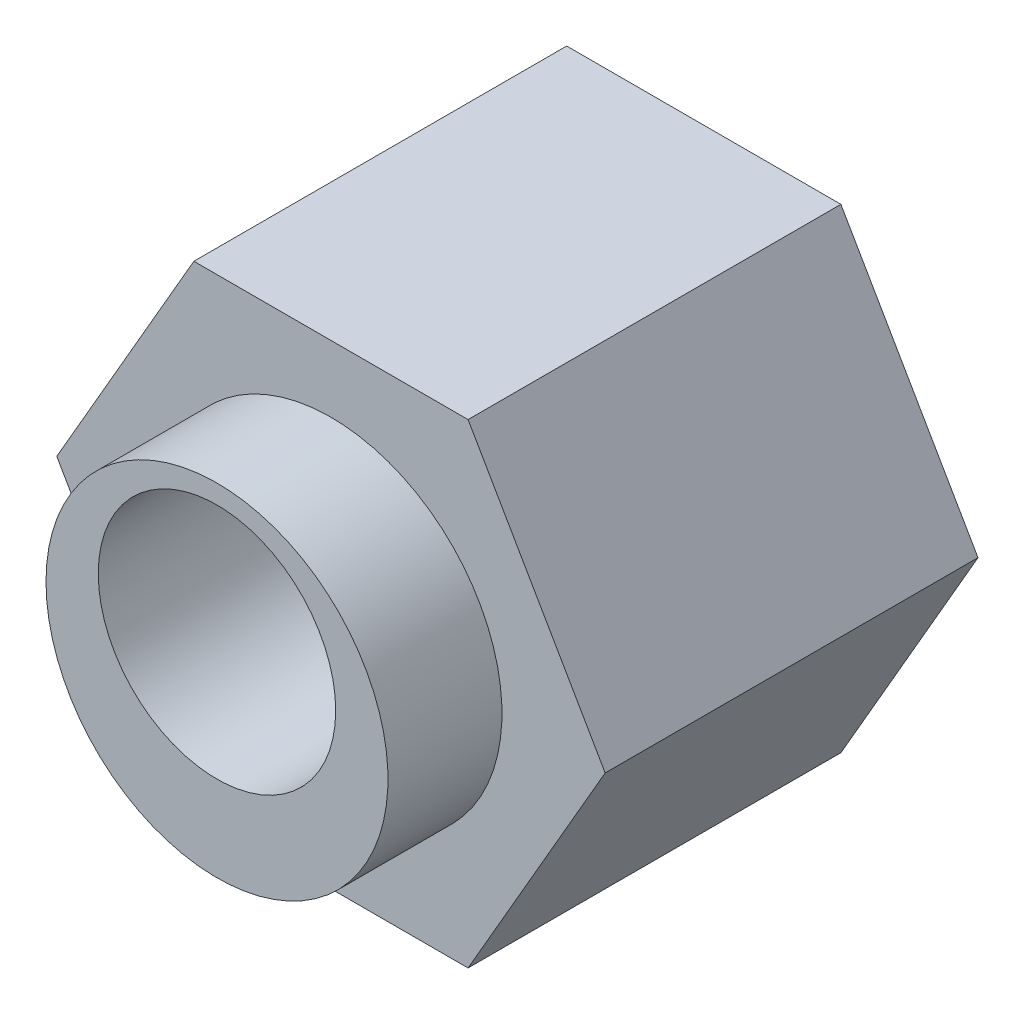
ISO-10303-21;
HEADER;
FILE_DESCRIPTION(('STEP AP214'),'2;1');
FILE_NAME('part.step','',(''),(''),'','','');
FILE_SCHEMA(('AUTOMOTIVE_DESIGN { 1 0 10303 214 1 1 1 1 }'));
ENDSEC;
DATA;
#1=APPLICATION_CONTEXT('core data for automotive mechanical design processes');
#2=APPLICATION_PROTOCOL_DEFINITION('international standard','automotive_design',2000,#1);
#3=PRODUCT_CONTEXT('',#1,'mechanical');
#4=PRODUCT('Part','Part','',(#3));
#5=PRODUCT_RELATED_PRODUCT_CATEGORY('part','',(#4));
#6=PRODUCT_DEFINITION_FORMATION('','',#4);
#7=PRODUCT_DEFINITION_CONTEXT('part definition',#1,'design');
#8=PRODUCT_DEFINITION('design','',#6,#7);
#9=PRODUCT_DEFINITION_SHAPE('','',#8);
#10=(LENGTH_UNIT() NAMED_UNIT(*) SI_UNIT(.MILLI.,.METRE.));
#11=(NAMED_UNIT(*) PLANE_ANGLE_UNIT() SI_UNIT($,.RADIAN.));
#12=(NAMED_UNIT(*) SI_UNIT($,.STERADIAN.) SOLID_ANGLE_UNIT());
#13=UNCERTAINTY_MEASURE_WITH_UNIT(LENGTH_MEASURE(1.E-05),#10,'distance_accuracy_value','');
#14=(GEOMETRIC_REPRESENTATION_CONTEXT(3) GLOBAL_UNCERTAINTY_ASSIGNED_CONTEXT((#13)) GLOBAL_UNIT_ASSIGNED_CONTEXT((#10,
#11,#12)) REPRESENTATION_CONTEXT('',''));
#15=CARTESIAN_POINT('',(0.,0.,0.));
#16=DIRECTION('',(0.,0.,1.));
#17=DIRECTION('',(1.,0.,0.));
#18=AXIS2_PLACEMENT_3D('',#15,#16,#17);
#19=CARTESIAN_POINT('',(2.88675134594813,-5.,8.3));
#20=DIRECTION('',(0.,-1.,0.));
#21=DIRECTION('',(0.,0.,-1.));
#22=AXIS2_PLACEMENT_3D('',#19,#20,#21);
#23=PLANE('',#22);
#24=DIRECTION('',(-1.,0.,0.));
#25=VECTOR('',#24,1.);
#26=CARTESIAN_POINT('',(2.88675134594813,-5.,0.45));
#27=LINE('',#26,#25);
#28=CARTESIAN_POINT('',(2.88675134594813,-5.,0.45));
#29=VERTEX_POINT('',#28);
#30=CARTESIAN_POINT('',(-2.88675134594813,-5.,0.45));
#31=VERTEX_POINT('',#30);
#32=EDGE_CURVE('E125',#29,#31,#27,.T.);
#33=ORIENTED_EDGE('',*,*,#32,.F.);
#34=DIRECTION('',(0.,0.,-1.));
#35=VECTOR('',#34,1.);
#36=CARTESIAN_POINT('',(2.88675134594813,-5.,8.3));
#37=LINE('',#36,#35);
#38=CARTESIAN_POINT('',(2.88675134594813,-5.,8.3));
#39=VERTEX_POINT('',#38);
#40=EDGE_CURVE('E54',#39,#29,#37,.T.);
#41=ORIENTED_EDGE('',*,*,#40,.F.);
#42=DIRECTION('',(-1.,0.,0.));
#43=VECTOR('',#42,1.);
#44=CARTESIAN_POINT('',(2.88675134594813,-5.,8.3));
#45=LINE('',#44,#43);
#46=CARTESIAN_POINT('',(-2.88675134594813,-5.,8.3));
#47=VERTEX_POINT('',#46);
#48=EDGE_CURVE('E141',#39,#47,#45,.T.);
#49=ORIENTED_EDGE('',*,*,#48,.T.);
#50=DIRECTION('',(0.,0.,-1.));
#51=VECTOR('',#50,1.);
#52=CARTESIAN_POINT('',(-2.88675134594813,-5.,8.3));
#53=LINE('',#52,#51);
#54=EDGE_CURVE('E89',#47,#31,#53,.T.);
#55=ORIENTED_EDGE('',*,*,#54,.T.);
#56=EDGE_LOOP('',(#33,#41,#49,#55));
#57=FACE_BOUND('',#56,.T.);
#58=ADVANCED_FACE('F37',(#57),#23,.T.);
#59=CARTESIAN_POINT('',(5.77350269189626,0.,8.3));
#60=DIRECTION('',(0.866025403784438,-0.500000000000001,0.));
#61=DIRECTION('',(0.500000000000001,0.866025403784438,0.));
#62=AXIS2_PLACEMENT_3D('',#59,#60,#61);
#63=PLANE('',#62);
#64=DIRECTION('',(-0.500000000000001,-0.866025403784438,0.));
#65=VECTOR('',#64,1.);
#66=CARTESIAN_POINT('',(5.77350269189626,0.,0.45));
#67=LINE('',#66,#65);
#68=CARTESIAN_POINT('',(5.77350269189626,0.,0.45));
#69=VERTEX_POINT('',#68);
#70=EDGE_CURVE('E138',#69,#29,#67,.T.);
#71=ORIENTED_EDGE('',*,*,#70,.F.);
#72=DIRECTION('',(0.,0.,-1.));
#73=VECTOR('',#72,1.);
#74=CARTESIAN_POINT('',(5.77350269189626,0.,8.3));
#75=LINE('',#74,#73);
#76=CARTESIAN_POINT('',(5.77350269189626,0.,8.3));
#77=VERTEX_POINT('',#76);
#78=EDGE_CURVE('E77',#77,#69,#75,.T.);
#79=ORIENTED_EDGE('',*,*,#78,.F.);
#80=DIRECTION('',(-0.500000000000001,-0.866025403784438,0.));
#81=VECTOR('',#80,1.);
#82=CARTESIAN_POINT('',(5.77350269189626,0.,8.3));
#83=LINE('',#82,#81);
#84=EDGE_CURVE('E115',#77,#39,#83,.T.);
#85=ORIENTED_EDGE('',*,*,#84,.T.);
#86=ORIENTED_EDGE('',*,*,#40,.T.);
#87=EDGE_LOOP('',(#71,#79,#85,#86));
#88=FACE_BOUND('',#87,.T.);
#89=ADVANCED_FACE('F186',(#88),#63,.T.);
#90=CARTESIAN_POINT('',(2.88675134594813,5.,8.3));
#91=DIRECTION('',(0.866025403784438,0.5,0.));
#92=DIRECTION('',(-0.5,0.866025403784439,0.));
#93=AXIS2_PLACEMENT_3D('',#90,#91,#92);
#94=PLANE('',#93);
#95=DIRECTION('',(0.5,-0.866025403784439,0.));
#96=VECTOR('',#95,1.);
#97=CARTESIAN_POINT('',(2.88675134594813,5.,0.45));
#98=LINE('',#97,#96);
#99=CARTESIAN_POINT('',(2.88675134594813,5.,0.45));
#100=VERTEX_POINT('',#99);
#101=EDGE_CURVE('E102',#100,#69,#98,.T.);
#102=ORIENTED_EDGE('',*,*,#101,.F.);
#103=DIRECTION('',(0.,0.,-1.));
#104=VECTOR('',#103,1.);
#105=CARTESIAN_POINT('',(2.88675134594813,5.,8.3));
#106=LINE('',#105,#104);
#107=CARTESIAN_POINT('',(2.88675134594813,5.,8.3));
#108=VERTEX_POINT('',#107);
#109=EDGE_CURVE('E97',#108,#100,#106,.T.);
#110=ORIENTED_EDGE('',*,*,#109,.F.);
#111=DIRECTION('',(0.5,-0.866025403784439,0.));
#112=VECTOR('',#111,1.);
#113=CARTESIAN_POINT('',(2.88675134594813,5.,8.3));
#114=LINE('',#113,#112);
#115=EDGE_CURVE('E100',#108,#77,#114,.T.);
#116=ORIENTED_EDGE('',*,*,#115,.T.);
#117=ORIENTED_EDGE('',*,*,#78,.T.);
#118=EDGE_LOOP('',(#102,#110,#116,#117));
#119=FACE_BOUND('',#118,.T.);
#120=ADVANCED_FACE('F99',(#119),#94,.T.);
#121=CARTESIAN_POINT('',(-2.88675134594813,5.,8.3));
#122=DIRECTION('',(0.,1.,0.));
#123=DIRECTION('',(-1.,0.,0.));
#124=AXIS2_PLACEMENT_3D('',#121,#122,#123);
#125=PLANE('',#124);
#126=DIRECTION('',(1.,0.,0.));
#127=VECTOR('',#126,1.);
#128=CARTESIAN_POINT('',(-2.88675134594813,5.,0.45));
#129=LINE('',#128,#127);
#130=CARTESIAN_POINT('',(-2.88675134594813,5.,0.45));
#131=VERTEX_POINT('',#130);
#132=EDGE_CURVE('E135',#131,#100,#129,.T.);
#133=ORIENTED_EDGE('',*,*,#132,.F.);
#134=DIRECTION('',(0.,0.,-1.));
#135=VECTOR('',#134,1.);
#136=CARTESIAN_POINT('',(-2.88675134594813,5.,8.3));
#137=LINE('',#136,#135);
#138=CARTESIAN_POINT('',(-2.88675134594813,5.,8.3));
#139=VERTEX_POINT('',#138);
#140=EDGE_CURVE('E107',#139,#131,#137,.T.);
#141=ORIENTED_EDGE('',*,*,#140,.F.);
#142=DIRECTION('',(1.,0.,0.));
#143=VECTOR('',#142,1.);
#144=CARTESIAN_POINT('',(-2.88675134594813,5.,8.3));
#145=LINE('',#144,#143);
#146=EDGE_CURVE('E113',#139,#108,#145,.T.);
#147=ORIENTED_EDGE('',*,*,#146,.T.);
#148=ORIENTED_EDGE('',*,*,#109,.T.);
#149=EDGE_LOOP('',(#133,#141,#147,#148));
#150=FACE_BOUND('',#149,.T.);
#151=ADVANCED_FACE('F117',(#150),#125,.T.);
#152=CARTESIAN_POINT('',(-5.77350269189626,0.,8.3));
#153=DIRECTION('',(-0.866025403784438,0.500000000000001,0.));
#154=DIRECTION('',(-0.500000000000001,-0.866025403784438,0.));
#155=AXIS2_PLACEMENT_3D('',#152,#153,#154);
#156=PLANE('',#155);
#157=DIRECTION('',(0.500000000000001,0.866025403784438,0.));
#158=VECTOR('',#157,1.);
#159=CARTESIAN_POINT('',(-5.77350269189626,0.,0.45));
#160=LINE('',#159,#158);
#161=CARTESIAN_POINT('',(-5.77350269189626,0.,0.45));
#162=VERTEX_POINT('',#161);
#163=EDGE_CURVE('E132',#162,#131,#160,.T.);
#164=ORIENTED_EDGE('',*,*,#163,.F.);
#165=DIRECTION('',(0.,0.,-1.));
#166=VECTOR('',#165,1.);
#167=CARTESIAN_POINT('',(-5.77350269189626,0.,8.3));
#168=LINE('',#167,#166);
#169=CARTESIAN_POINT('',(-5.77350269189626,0.,8.3));
#170=VERTEX_POINT('',#169);
#171=EDGE_CURVE('E146',#170,#162,#168,.T.);
#172=ORIENTED_EDGE('',*,*,#171,.F.);
#173=DIRECTION('',(0.500000000000001,0.866025403784438,0.));
#174=VECTOR('',#173,1.);
#175=CARTESIAN_POINT('',(-5.77350269189626,0.,8.3));
#176=LINE('',#175,#174);
#177=EDGE_CURVE('E118',#170,#139,#176,.T.);
#178=ORIENTED_EDGE('',*,*,#177,.T.);
#179=ORIENTED_EDGE('',*,*,#140,.T.);
#180=EDGE_LOOP('',(#164,#172,#178,#179));
#181=FACE_BOUND('',#180,.T.);
#182=ADVANCED_FACE('F200',(#181),#156,.T.);
#183=CARTESIAN_POINT('',(-2.88675134594813,-5.,8.3));
#184=DIRECTION('',(-0.866025403784438,-0.5,0.));
#185=DIRECTION('',(0.5,-0.866025403784439,0.));
#186=AXIS2_PLACEMENT_3D('',#183,#184,#185);
#187=PLANE('',#186);
#188=DIRECTION('',(-0.5,0.866025403784439,0.));
#189=VECTOR('',#188,1.);
#190=CARTESIAN_POINT('',(-2.88675134594813,-5.,0.45));
#191=LINE('',#190,#189);
#192=EDGE_CURVE('E128',#31,#162,#191,.T.);
#193=ORIENTED_EDGE('',*,*,#192,.F.);
#194=ORIENTED_EDGE('',*,*,#54,.F.);
#195=DIRECTION('',(-0.5,0.866025403784439,0.));
#196=VECTOR('',#195,1.);
#197=CARTESIAN_POINT('',(-2.88675134594813,-5.,8.3));
#198=LINE('',#197,#196);
#199=EDGE_CURVE('E120',#47,#170,#198,.T.);
#200=ORIENTED_EDGE('',*,*,#199,.T.);
#201=ORIENTED_EDGE('',*,*,#171,.T.);
#202=EDGE_LOOP('',(#193,#194,#200,#201));
#203=FACE_BOUND('',#202,.T.);
#204=ADVANCED_FACE('F182',(#203),#187,.T.);
#205=CARTESIAN_POINT('',(0.,0.,8.3));
#206=DIRECTION('',(0.,0.,-1.));
#207=DIRECTION('',(-1.,0.,0.));
#208=AXIS2_PLACEMENT_3D('',#205,#206,#207);
#209=PLANE('',#208);
#210=CARTESIAN_POINT('',(0.,0.,8.3));
#211=DIRECTION('',(0.,0.,-1.));
#212=DIRECTION('',(-1.,0.,0.));
#213=AXIS2_PLACEMENT_3D('',#210,#211,#212);
#214=CIRCLE('',#213,3.6);
#215=CARTESIAN_POINT('',(-3.6,0.,8.3));
#216=VERTEX_POINT('',#215);
#217=EDGE_CURVE('E173',#216,#216,#214,.T.);
#218=ORIENTED_EDGE('',*,*,#217,.T.);
#219=EDGE_LOOP('',(#218));
#220=FACE_BOUND('',#219,.T.);
#221=ORIENTED_EDGE('',*,*,#48,.F.);
#222=ORIENTED_EDGE('',*,*,#84,.F.);
#223=ORIENTED_EDGE('',*,*,#115,.F.);
#224=ORIENTED_EDGE('',*,*,#146,.F.);
#225=ORIENTED_EDGE('',*,*,#177,.F.);
#226=ORIENTED_EDGE('',*,*,#199,.F.);
#227=EDGE_LOOP('',(#221,#222,#223,#224,#225,#226));
#228=FACE_BOUND('',#227,.T.);
#229=ADVANCED_FACE('F111',(#220,#228),#209,.F.);
#230=CARTESIAN_POINT('',(0.,0.,0.45));
#231=DIRECTION('',(0.,0.,-1.));
#232=DIRECTION('',(-1.,0.,0.));
#233=AXIS2_PLACEMENT_3D('',#230,#231,#232);
#234=PLANE('',#233);
#235=CARTESIAN_POINT('',(0.,0.7,0.45));
#236=DIRECTION('',(0.,0.,-1.));
#237=DIRECTION('',(-1.,0.,0.));
#238=AXIS2_PLACEMENT_3D('',#235,#236,#237);
#239=CIRCLE('',#238,3.6);
#240=CARTESIAN_POINT('',(-3.6,0.7,0.45));
#241=VERTEX_POINT('',#240);
#242=EDGE_CURVE('E143',#241,#241,#239,.T.);
#243=ORIENTED_EDGE('',*,*,#242,.F.);
#244=EDGE_LOOP('',(#243));
#245=FACE_BOUND('',#244,.T.);
#246=ORIENTED_EDGE('',*,*,#32,.T.);
#247=ORIENTED_EDGE('',*,*,#192,.T.);
#248=ORIENTED_EDGE('',*,*,#163,.T.);
#249=ORIENTED_EDGE('',*,*,#132,.T.);
#250=ORIENTED_EDGE('',*,*,#101,.T.);
#251=ORIENTED_EDGE('',*,*,#70,.T.);
#252=EDGE_LOOP('',(#246,#247,#248,#249,#250,#251));
#253=FACE_BOUND('',#252,.T.);
#254=ADVANCED_FACE('F185',(#245,#253),#234,.T.);
#255=CARTESIAN_POINT('',(0.,0.,10.7));
#256=DIRECTION('',(0.,0.,-1.));
#257=DIRECTION('',(-1.,0.,0.));
#258=AXIS2_PLACEMENT_3D('',#255,#256,#257);
#259=CYLINDRICAL_SURFACE('',#258,3.6);
#260=CARTESIAN_POINT('',(0.,0.,10.7));
#261=DIRECTION('',(0.,0.,-1.));
#262=DIRECTION('',(-1.,0.,0.));
#263=AXIS2_PLACEMENT_3D('',#260,#261,#262);
#264=CIRCLE('',#263,3.6);
#265=CARTESIAN_POINT('',(-3.6,0.,10.7));
#266=VERTEX_POINT('',#265);
#267=EDGE_CURVE('E129',#266,#266,#264,.T.);
#268=ORIENTED_EDGE('',*,*,#267,.T.);
#269=EDGE_LOOP('',(#268));
#270=FACE_BOUND('',#269,.T.);
#271=ORIENTED_EDGE('',*,*,#217,.F.);
#272=EDGE_LOOP('',(#271));
#273=FACE_BOUND('',#272,.T.);
#274=ADVANCED_FACE('F212',(#270,#273),#259,.T.);
#275=CARTESIAN_POINT('',(3.6,0.,10.7));
#276=DIRECTION('',(0.,0.,1.));
#277=DIRECTION('',(1.,0.,0.));
#278=AXIS2_PLACEMENT_3D('',#275,#276,#277);
#279=PLANE('',#278);
#280=CARTESIAN_POINT('',(0.,0.7,10.7));
#281=DIRECTION('',(0.,0.,-1.));
#282=DIRECTION('',(-1.,0.,0.));
#283=AXIS2_PLACEMENT_3D('',#280,#281,#282);
#284=CIRCLE('',#283,2.49999999999998);
#285=CARTESIAN_POINT('',(-2.49999999999998,0.7,10.7));
#286=VERTEX_POINT('',#285);
#287=EDGE_CURVE('E171',#286,#286,#284,.T.);
#288=ORIENTED_EDGE('',*,*,#287,.T.);
#289=EDGE_LOOP('',(#288));
#290=FACE_BOUND('',#289,.T.);
#291=ORIENTED_EDGE('',*,*,#267,.F.);
#292=EDGE_LOOP('',(#291));
#293=FACE_BOUND('',#292,.T.);
#294=ADVANCED_FACE('F217',(#290,#293),#279,.T.);
#295=CARTESIAN_POINT('',(0.,0.7,0.45));
#296=DIRECTION('',(0.,0.,-1.));
#297=DIRECTION('',(-1.,0.,0.));
#298=AXIS2_PLACEMENT_3D('',#295,#296,#297);
#299=CYLINDRICAL_SURFACE('',#298,3.6);
#300=CARTESIAN_POINT('',(0.,0.7,0.0500000000317464));
#301=DIRECTION('',(0.,0.,-1.));
#302=DIRECTION('',(-1.,0.,0.));
#303=AXIS2_PLACEMENT_3D('',#300,#301,#302);
#304=CIRCLE('',#303,3.6);
#305=CARTESIAN_POINT('',(-3.6,0.7,0.0500000000317464));
#306=VERTEX_POINT('',#305);
#307=EDGE_CURVE('E11',#306,#306,#304,.F.);
#308=ORIENTED_EDGE('',*,*,#307,.T.);
#309=EDGE_LOOP('',(#308));
#310=FACE_BOUND('',#309,.T.);
#311=ORIENTED_EDGE('',*,*,#242,.T.);
#312=EDGE_LOOP('',(#311));
#313=FACE_BOUND('',#312,.T.);
#314=ADVANCED_FACE('F221',(#310,#313),#299,.T.);
#315=CARTESIAN_POINT('',(0.,0.7,-0.0499999999999997));
#316=DIRECTION('',(0.,0.,-1.));
#317=DIRECTION('',(-1.,0.,0.));
#318=AXIS2_PLACEMENT_3D('',#315,#316,#317);
#319=PLANE('',#318);
#320=CARTESIAN_POINT('',(0.,0.7,-0.0499999999999997));
#321=DIRECTION('',(0.,0.,-1.));
#322=DIRECTION('',(-1.,0.,0.));
#323=AXIS2_PLACEMENT_3D('',#320,#321,#322);
#324=CIRCLE('',#323,2.60000000003172);
#325=CARTESIAN_POINT('',(-2.60000000003172,0.7,-0.0499999999999997));
#326=VERTEX_POINT('',#325);
#327=EDGE_CURVE('E46',#326,#326,#324,.F.);
#328=ORIENTED_EDGE('',*,*,#327,.T.);
#329=EDGE_LOOP('',(#328));
#330=FACE_BOUND('',#329,.T.);
#331=CARTESIAN_POINT('',(0.,0.7,-0.0499999999999997));
#332=DIRECTION('',(0.,0.,-1.));
#333=DIRECTION('',(-1.,0.,0.));
#334=AXIS2_PLACEMENT_3D('',#331,#332,#333);
#335=CIRCLE('',#334,3.49999999996826);
#336=CARTESIAN_POINT('',(-3.49999999996826,0.7,-0.0499999999999997));
#337=VERTEX_POINT('',#336);
#338=EDGE_CURVE('E152',#337,#337,#335,.T.);
#339=ORIENTED_EDGE('',*,*,#338,.T.);
#340=EDGE_LOOP('',(#339));
#341=FACE_BOUND('',#340,.T.);
#342=ADVANCED_FACE('F157',(#330,#341),#319,.T.);
#343=CARTESIAN_POINT('',(0.,0.7,-0.0499999999999997));
#344=DIRECTION('',(0.,0.,-1.));
#345=DIRECTION('',(-1.,0.,0.));
#346=AXIS2_PLACEMENT_3D('',#343,#344,#345);
#347=CYLINDRICAL_SURFACE('',#346,2.49999999999998);
#348=CARTESIAN_POINT('',(0.,0.7,0.0500000000317404));
#349=DIRECTION('',(0.,0.,-1.));
#350=DIRECTION('',(-1.,0.,0.));
#351=AXIS2_PLACEMENT_3D('',#348,#349,#350);
#352=CIRCLE('',#351,2.49999999999998);
#353=CARTESIAN_POINT('',(-2.49999999999998,0.7,0.0500000000317404));
#354=VERTEX_POINT('',#353);
#355=EDGE_CURVE('E149',#354,#354,#352,.T.);
#356=ORIENTED_EDGE('',*,*,#355,.T.);
#357=EDGE_LOOP('',(#356));
#358=FACE_BOUND('',#357,.T.);
#359=ORIENTED_EDGE('',*,*,#287,.F.);
#360=EDGE_LOOP('',(#359));
#361=FACE_BOUND('',#360,.T.);
#362=ADVANCED_FACE('F163',(#358,#361),#347,.F.);
#363=CARTESIAN_POINT('',(0.,0.7,0.0500000000317404));
#364=DIRECTION('',(0.,0.,-1.));
#365=DIRECTION('',(-1.,0.,0.));
#366=AXIS2_PLACEMENT_3D('',#363,#364,#365);
#367=CONICAL_SURFACE('',#366,2.49999999999998,0.785398163397459);
#368=ORIENTED_EDGE('',*,*,#327,.F.);
#369=EDGE_LOOP('',(#368));
#370=FACE_BOUND('',#369,.T.);
#371=ORIENTED_EDGE('',*,*,#355,.F.);
#372=EDGE_LOOP('',(#371));
#373=FACE_BOUND('',#372,.T.);
#374=ADVANCED_FACE('F160',(#370,#373),#367,.F.);
#375=CARTESIAN_POINT('',(0.,0.7,-0.0499999999999997));
#376=DIRECTION('',(0.,0.,1.));
#377=DIRECTION('',(1.,0.,0.));
#378=AXIS2_PLACEMENT_3D('',#375,#376,#377);
#379=CONICAL_SURFACE('',#378,3.49999999996826,0.78539816339744);
#380=ORIENTED_EDGE('',*,*,#307,.F.);
#381=EDGE_LOOP('',(#380));
#382=FACE_BOUND('',#381,.T.);
#383=ORIENTED_EDGE('',*,*,#338,.F.);
#384=EDGE_LOOP('',(#383));
#385=FACE_BOUND('',#384,.T.);
#386=ADVANCED_FACE('F39',(#382,#385),#379,.T.);
#387=CLOSED_SHELL('',(#58,#89,#120,#151,#182,#204,#229,#254,#274,#294,#314,#342,#362,#374,#386));
#388=MANIFOLD_SOLID_BREP('B2',#387);
#389=ADVANCED_BREP_SHAPE_REPRESENTATION('',(#18,#388),#14);
#390=SHAPE_DEFINITION_REPRESENTATION(#9,#389);
ENDSEC;
END-ISO-10303-21;
